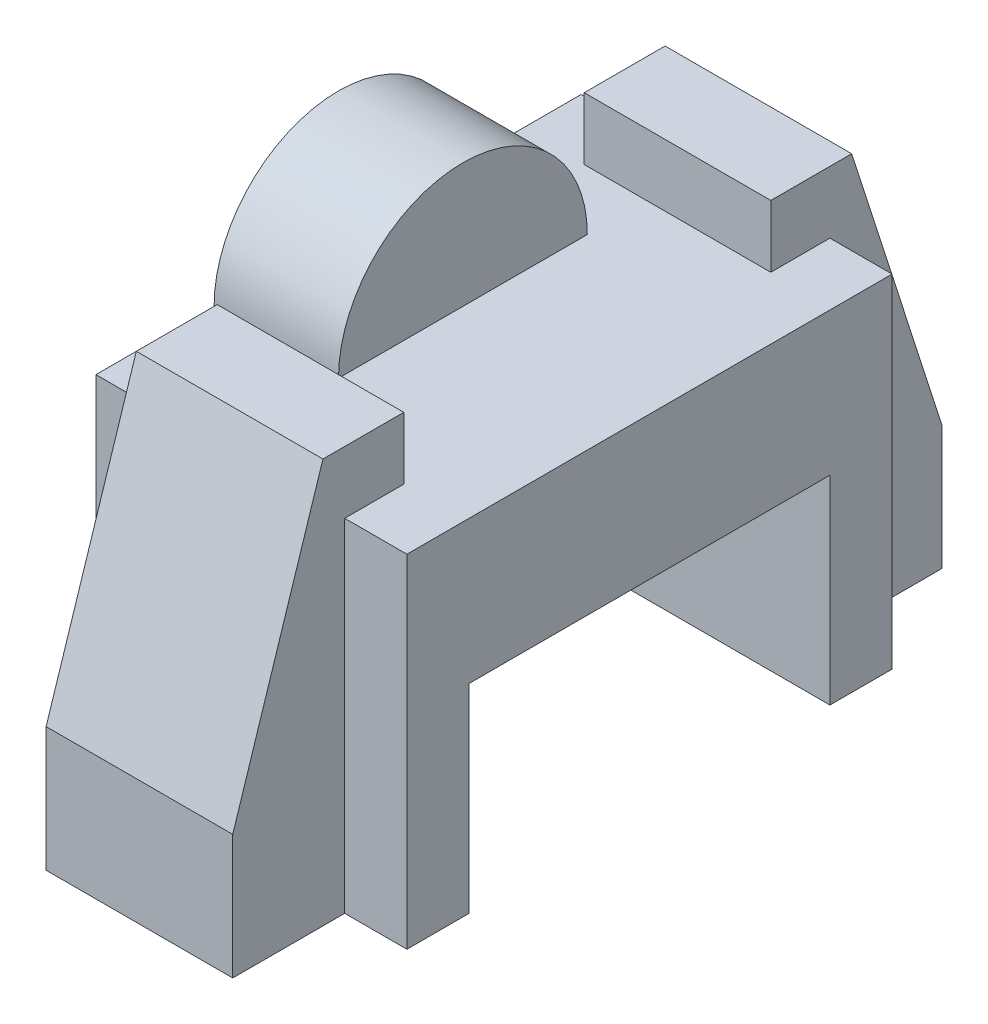
ISO-10303-21;
HEADER;
FILE_DESCRIPTION(('STEP AP214'),'2;1');
FILE_NAME('part.step','',(''),(''),'','','');
FILE_SCHEMA(('AUTOMOTIVE_DESIGN { 1 0 10303 214 1 1 1 1 }'));
ENDSEC;
DATA;
#1=APPLICATION_CONTEXT('core data for automotive mechanical design processes');
#2=APPLICATION_PROTOCOL_DEFINITION('international standard','automotive_design',2000,#1);
#3=PRODUCT_CONTEXT('',#1,'mechanical');
#4=PRODUCT('Part','Part','',(#3));
#5=PRODUCT_RELATED_PRODUCT_CATEGORY('part','',(#4));
#6=PRODUCT_DEFINITION_FORMATION('','',#4);
#7=PRODUCT_DEFINITION_CONTEXT('part definition',#1,'design');
#8=PRODUCT_DEFINITION('design','',#6,#7);
#9=PRODUCT_DEFINITION_SHAPE('','',#8);
#10=(LENGTH_UNIT() NAMED_UNIT(*) SI_UNIT(.MILLI.,.METRE.));
#11=(NAMED_UNIT(*) PLANE_ANGLE_UNIT() SI_UNIT($,.RADIAN.));
#12=(NAMED_UNIT(*) SI_UNIT($,.STERADIAN.) SOLID_ANGLE_UNIT());
#13=UNCERTAINTY_MEASURE_WITH_UNIT(LENGTH_MEASURE(1.E-05),#10,'distance_accuracy_value','');
#14=(GEOMETRIC_REPRESENTATION_CONTEXT(3) GLOBAL_UNCERTAINTY_ASSIGNED_CONTEXT((#13)) GLOBAL_UNIT_ASSIGNED_CONTEXT((#10,
#11,#12)) REPRESENTATION_CONTEXT('',''));
#15=CARTESIAN_POINT('',(0.,0.,0.));
#16=DIRECTION('',(0.,0.,1.));
#17=DIRECTION('',(1.,0.,0.));
#18=AXIS2_PLACEMENT_3D('',#15,#16,#17);
#19=CARTESIAN_POINT('',(25.,27.5,39.));
#20=DIRECTION('',(0.,-1.,0.));
#21=DIRECTION('',(0.,0.,-1.));
#22=AXIS2_PLACEMENT_3D('',#19,#20,#21);
#23=PLANE('',#22);
#24=DIRECTION('',(-1.,0.,0.));
#25=VECTOR('',#24,1.);
#26=CARTESIAN_POINT('',(-5.,27.5,20.));
#27=LINE('',#26,#25);
#28=CARTESIAN_POINT('',(-5.,27.5,20.));
#29=VERTEX_POINT('',#28);
#30=CARTESIAN_POINT('',(-25.,27.5,20.));
#31=VERTEX_POINT('',#30);
#32=EDGE_CURVE('E211',#29,#31,#27,.T.);
#33=ORIENTED_EDGE('',*,*,#32,.T.);
#34=DIRECTION('',(0.,0.,1.));
#35=VECTOR('',#34,1.);
#36=CARTESIAN_POINT('',(-25.,27.5,39.));
#37=LINE('',#36,#35);
#38=CARTESIAN_POINT('',(-25.,27.5,39.));
#39=VERTEX_POINT('',#38);
#40=EDGE_CURVE('E196',#31,#39,#37,.T.);
#41=ORIENTED_EDGE('',*,*,#40,.T.);
#42=DIRECTION('',(-1.,0.,0.));
#43=VECTOR('',#42,1.);
#44=CARTESIAN_POINT('',(25.,27.5,39.));
#45=LINE('',#44,#43);
#46=CARTESIAN_POINT('',(-15.,27.5,39.));
#47=VERTEX_POINT('',#46);
#48=EDGE_CURVE('E365',#47,#39,#45,.T.);
#49=ORIENTED_EDGE('',*,*,#48,.F.);
#50=DIRECTION('',(0.,0.,-1.));
#51=VECTOR('',#50,1.);
#52=CARTESIAN_POINT('',(-15.,27.5,39.));
#53=LINE('',#52,#51);
#54=CARTESIAN_POINT('',(-15.,27.5,29.5));
#55=VERTEX_POINT('',#54);
#56=EDGE_CURVE('E290',#47,#55,#53,.T.);
#57=ORIENTED_EDGE('',*,*,#56,.T.);
#58=DIRECTION('',(-1.,0.,0.));
#59=VECTOR('',#58,1.);
#60=CARTESIAN_POINT('',(15.,27.5,29.5));
#61=LINE('',#60,#59);
#62=CARTESIAN_POINT('',(15.,27.5,29.5));
#63=VERTEX_POINT('',#62);
#64=EDGE_CURVE('E314',#63,#55,#61,.T.);
#65=ORIENTED_EDGE('',*,*,#64,.F.);
#66=DIRECTION('',(0.,0.,-1.));
#67=VECTOR('',#66,1.);
#68=CARTESIAN_POINT('',(15.,27.5,39.));
#69=LINE('',#68,#67);
#70=CARTESIAN_POINT('',(15.,27.5,39.));
#71=VERTEX_POINT('',#70);
#72=EDGE_CURVE('E274',#71,#63,#69,.T.);
#73=ORIENTED_EDGE('',*,*,#72,.F.);
#74=CARTESIAN_POINT('',(25.,27.5,39.));
#75=VERTEX_POINT('',#74);
#76=EDGE_CURVE('E366',#75,#71,#45,.T.);
#77=ORIENTED_EDGE('',*,*,#76,.F.);
#78=DIRECTION('',(0.,0.,1.));
#79=VECTOR('',#78,1.);
#80=CARTESIAN_POINT('',(25.,27.5,39.));
#81=LINE('',#80,#79);
#82=CARTESIAN_POINT('',(25.,27.5,-39.));
#83=VERTEX_POINT('',#82);
#84=EDGE_CURVE('E319',#83,#75,#81,.T.);
#85=ORIENTED_EDGE('',*,*,#84,.F.);
#86=DIRECTION('',(-1.,0.,0.));
#87=VECTOR('',#86,1.);
#88=CARTESIAN_POINT('',(25.,27.5,-39.));
#89=LINE('',#88,#87);
#90=CARTESIAN_POINT('',(15.,27.5,-39.));
#91=VERTEX_POINT('',#90);
#92=EDGE_CURVE('E11',#83,#91,#89,.T.);
#93=ORIENTED_EDGE('',*,*,#92,.T.);
#94=DIRECTION('',(0.,0.,-1.));
#95=VECTOR('',#94,1.);
#96=CARTESIAN_POINT('',(15.,27.5,-39.));
#97=LINE('',#96,#95);
#98=CARTESIAN_POINT('',(15.,27.5,-29.5));
#99=VERTEX_POINT('',#98);
#100=EDGE_CURVE('E230',#99,#91,#97,.T.);
#101=ORIENTED_EDGE('',*,*,#100,.F.);
#102=DIRECTION('',(-1.,0.,0.));
#103=VECTOR('',#102,1.);
#104=CARTESIAN_POINT('',(15.,27.5,-29.5));
#105=LINE('',#104,#103);
#106=CARTESIAN_POINT('',(-15.,27.5,-29.5));
#107=VERTEX_POINT('',#106);
#108=EDGE_CURVE('E266',#99,#107,#105,.T.);
#109=ORIENTED_EDGE('',*,*,#108,.T.);
#110=DIRECTION('',(0.,0.,-1.));
#111=VECTOR('',#110,1.);
#112=CARTESIAN_POINT('',(-15.,27.5,-39.));
#113=LINE('',#112,#111);
#114=CARTESIAN_POINT('',(-15.,27.5,-39.));
#115=VERTEX_POINT('',#114);
#116=EDGE_CURVE('E248',#107,#115,#113,.T.);
#117=ORIENTED_EDGE('',*,*,#116,.T.);
#118=CARTESIAN_POINT('',(-25.,27.5,-39.));
#119=VERTEX_POINT('',#118);
#120=EDGE_CURVE('E44',#115,#119,#89,.T.);
#121=ORIENTED_EDGE('',*,*,#120,.T.);
#122=CARTESIAN_POINT('',(-25.,27.5,-20.));
#123=VERTEX_POINT('',#122);
#124=EDGE_CURVE('E207',#119,#123,#37,.T.);
#125=ORIENTED_EDGE('',*,*,#124,.T.);
#126=DIRECTION('',(-1.,0.,0.));
#127=VECTOR('',#126,1.);
#128=CARTESIAN_POINT('',(-5.,27.5,-20.));
#129=LINE('',#128,#127);
#130=CARTESIAN_POINT('',(-5.,27.5,-20.));
#131=VERTEX_POINT('',#130);
#132=EDGE_CURVE('E56',#131,#123,#129,.T.);
#133=ORIENTED_EDGE('',*,*,#132,.F.);
#134=DIRECTION('',(0.,0.,-1.));
#135=VECTOR('',#134,1.);
#136=CARTESIAN_POINT('',(-5.,27.5,0.));
#137=LINE('',#136,#135);
#138=EDGE_CURVE('E51',#29,#131,#137,.T.);
#139=ORIENTED_EDGE('',*,*,#138,.F.);
#140=EDGE_LOOP('',(#33,#41,#49,#57,#65,#73,#77,#85,#93,#101,#109,#117,#121,#125,#133,#139));
#141=FACE_BOUND('',#140,.T.);
#142=ADVANCED_FACE('F36',(#141),#23,.F.);
#143=CARTESIAN_POINT('',(25.,27.5,-39.));
#144=DIRECTION('',(0.,0.,1.));
#145=DIRECTION('',(1.,0.,0.));
#146=AXIS2_PLACEMENT_3D('',#143,#144,#145);
#147=PLANE('',#146);
#148=DIRECTION('',(0.,-1.,0.));
#149=VECTOR('',#148,1.);
#150=CARTESIAN_POINT('',(15.,-27.5,-39.));
#151=LINE('',#150,#149);
#152=CARTESIAN_POINT('',(15.,-27.5,-39.));
#153=VERTEX_POINT('',#152);
#154=EDGE_CURVE('E233',#91,#153,#151,.T.);
#155=ORIENTED_EDGE('',*,*,#154,.F.);
#156=ORIENTED_EDGE('',*,*,#92,.F.);
#157=DIRECTION('',(0.,1.,0.));
#158=VECTOR('',#157,1.);
#159=CARTESIAN_POINT('',(25.,27.5,-39.));
#160=LINE('',#159,#158);
#161=CARTESIAN_POINT('',(25.,-27.5,-39.));
#162=VERTEX_POINT('',#161);
#163=EDGE_CURVE('E316',#162,#83,#160,.T.);
#164=ORIENTED_EDGE('',*,*,#163,.F.);
#165=DIRECTION('',(-1.,0.,0.));
#166=VECTOR('',#165,1.);
#167=CARTESIAN_POINT('',(25.,-27.5,-39.));
#168=LINE('',#167,#166);
#169=EDGE_CURVE('E348',#162,#153,#168,.T.);
#170=ORIENTED_EDGE('',*,*,#169,.T.);
#171=EDGE_LOOP('',(#155,#156,#164,#170));
#172=FACE_BOUND('',#171,.T.);
#173=ADVANCED_FACE('F406',(#172),#147,.F.);
#174=CARTESIAN_POINT('',(25.,27.5,39.));
#175=DIRECTION('',(0.,0.,-1.));
#176=DIRECTION('',(0.,1.,0.));
#177=AXIS2_PLACEMENT_3D('',#174,#175,#176);
#178=PLANE('',#177);
#179=DIRECTION('',(0.,1.,0.));
#180=VECTOR('',#179,1.);
#181=CARTESIAN_POINT('',(15.,-27.5,39.));
#182=LINE('',#181,#180);
#183=CARTESIAN_POINT('',(15.,-27.5,39.));
#184=VERTEX_POINT('',#183);
#185=EDGE_CURVE('E272',#184,#71,#182,.T.);
#186=ORIENTED_EDGE('',*,*,#185,.F.);
#187=DIRECTION('',(-1.,0.,0.));
#188=VECTOR('',#187,1.);
#189=CARTESIAN_POINT('',(25.,-27.5,39.));
#190=LINE('',#189,#188);
#191=CARTESIAN_POINT('',(25.,-27.5,39.));
#192=VERTEX_POINT('',#191);
#193=EDGE_CURVE('E363',#192,#184,#190,.T.);
#194=ORIENTED_EDGE('',*,*,#193,.F.);
#195=DIRECTION('',(0.,-1.,0.));
#196=VECTOR('',#195,1.);
#197=CARTESIAN_POINT('',(25.,27.5,39.));
#198=LINE('',#197,#196);
#199=EDGE_CURVE('E322',#75,#192,#198,.T.);
#200=ORIENTED_EDGE('',*,*,#199,.F.);
#201=ORIENTED_EDGE('',*,*,#76,.T.);
#202=EDGE_LOOP('',(#186,#194,#200,#201));
#203=FACE_BOUND('',#202,.T.);
#204=ADVANCED_FACE('F396',(#203),#178,.F.);
#205=ORIENTED_EDGE('',*,*,#120,.F.);
#206=DIRECTION('',(0.,-1.,0.));
#207=VECTOR('',#206,1.);
#208=CARTESIAN_POINT('',(-15.,-27.5,-39.));
#209=LINE('',#208,#207);
#210=CARTESIAN_POINT('',(-15.,-27.5,-39.));
#211=VERTEX_POINT('',#210);
#212=EDGE_CURVE('E250',#115,#211,#209,.T.);
#213=ORIENTED_EDGE('',*,*,#212,.T.);
#214=CARTESIAN_POINT('',(-25.,-27.5,-39.));
#215=VERTEX_POINT('',#214);
#216=EDGE_CURVE('E334',#211,#215,#168,.T.);
#217=ORIENTED_EDGE('',*,*,#216,.T.);
#218=DIRECTION('',(0.,1.,0.));
#219=VECTOR('',#218,1.);
#220=CARTESIAN_POINT('',(-25.,27.5,-39.));
#221=LINE('',#220,#219);
#222=EDGE_CURVE('E208',#215,#119,#221,.T.);
#223=ORIENTED_EDGE('',*,*,#222,.T.);
#224=EDGE_LOOP('',(#205,#213,#217,#223));
#225=FACE_BOUND('',#224,.T.);
#226=ADVANCED_FACE('F38',(#225),#147,.F.);
#227=CARTESIAN_POINT('',(-15.,-27.5,39.));
#228=VERTEX_POINT('',#227);
#229=CARTESIAN_POINT('',(-25.,-27.5,39.));
#230=VERTEX_POINT('',#229);
#231=EDGE_CURVE('E362',#228,#230,#190,.T.);
#232=ORIENTED_EDGE('',*,*,#231,.F.);
#233=DIRECTION('',(0.,1.,0.));
#234=VECTOR('',#233,1.);
#235=CARTESIAN_POINT('',(-15.,-27.5,39.));
#236=LINE('',#235,#234);
#237=EDGE_CURVE('E271',#228,#47,#236,.T.);
#238=ORIENTED_EDGE('',*,*,#237,.T.);
#239=ORIENTED_EDGE('',*,*,#48,.T.);
#240=DIRECTION('',(0.,-1.,0.));
#241=VECTOR('',#240,1.);
#242=CARTESIAN_POINT('',(-25.,27.5,39.));
#243=LINE('',#242,#241);
#244=EDGE_CURVE('E204',#39,#230,#243,.T.);
#245=ORIENTED_EDGE('',*,*,#244,.T.);
#246=EDGE_LOOP('',(#232,#238,#239,#245));
#247=FACE_BOUND('',#246,.T.);
#248=ADVANCED_FACE('F374',(#247),#178,.F.);
#249=CARTESIAN_POINT('',(25.,-27.5,39.));
#250=DIRECTION('',(0.,1.,0.));
#251=DIRECTION('',(0.,0.,1.));
#252=AXIS2_PLACEMENT_3D('',#249,#250,#251);
#253=PLANE('',#252);
#254=DIRECTION('',(0.,0.,-1.));
#255=VECTOR('',#254,1.);
#256=CARTESIAN_POINT('',(-25.,-27.5,39.));
#257=LINE('',#256,#255);
#258=CARTESIAN_POINT('',(-25.,-27.5,29.));
#259=VERTEX_POINT('',#258);
#260=EDGE_CURVE('E338',#230,#259,#257,.T.);
#261=ORIENTED_EDGE('',*,*,#260,.T.);
#262=DIRECTION('',(-1.,0.,0.));
#263=VECTOR('',#262,1.);
#264=CARTESIAN_POINT('',(25.,-27.5,29.));
#265=LINE('',#264,#263);
#266=CARTESIAN_POINT('',(25.,-27.5,29.));
#267=VERTEX_POINT('',#266);
#268=EDGE_CURVE('E359',#267,#259,#265,.T.);
#269=ORIENTED_EDGE('',*,*,#268,.F.);
#270=DIRECTION('',(0.,0.,-1.));
#271=VECTOR('',#270,1.);
#272=CARTESIAN_POINT('',(25.,-27.5,39.));
#273=LINE('',#272,#271);
#274=EDGE_CURVE('E324',#192,#267,#273,.T.);
#275=ORIENTED_EDGE('',*,*,#274,.F.);
#276=ORIENTED_EDGE('',*,*,#193,.T.);
#277=DIRECTION('',(0.,0.,-1.));
#278=VECTOR('',#277,1.);
#279=CARTESIAN_POINT('',(15.,-27.5,57.));
#280=LINE('',#279,#278);
#281=CARTESIAN_POINT('',(15.,-27.5,57.));
#282=VERTEX_POINT('',#281);
#283=EDGE_CURVE('E285',#282,#184,#280,.T.);
#284=ORIENTED_EDGE('',*,*,#283,.F.);
#285=DIRECTION('',(-1.,0.,0.));
#286=VECTOR('',#285,1.);
#287=CARTESIAN_POINT('',(15.,-27.5,57.));
#288=LINE('',#287,#286);
#289=CARTESIAN_POINT('',(-15.,-27.5,57.));
#290=VERTEX_POINT('',#289);
#291=EDGE_CURVE('E287',#282,#290,#288,.T.);
#292=ORIENTED_EDGE('',*,*,#291,.T.);
#293=DIRECTION('',(0.,0.,-1.));
#294=VECTOR('',#293,1.);
#295=CARTESIAN_POINT('',(-15.,-27.5,57.));
#296=LINE('',#295,#294);
#297=EDGE_CURVE('E275',#290,#228,#296,.T.);
#298=ORIENTED_EDGE('',*,*,#297,.T.);
#299=ORIENTED_EDGE('',*,*,#231,.T.);
#300=EDGE_LOOP('',(#261,#269,#275,#276,#284,#292,#298,#299));
#301=FACE_BOUND('',#300,.T.);
#302=ADVANCED_FACE('F451',(#301),#253,.F.);
#303=CARTESIAN_POINT('',(25.,-27.5,29.));
#304=DIRECTION('',(0.,0.,1.));
#305=DIRECTION('',(1.,0.,0.));
#306=AXIS2_PLACEMENT_3D('',#303,#304,#305);
#307=PLANE('',#306);
#308=DIRECTION('',(0.,1.,0.));
#309=VECTOR('',#308,1.);
#310=CARTESIAN_POINT('',(-25.,-27.5,29.));
#311=LINE('',#310,#309);
#312=CARTESIAN_POINT('',(-25.,4.49999999999999,29.));
#313=VERTEX_POINT('',#312);
#314=EDGE_CURVE('E340',#259,#313,#311,.T.);
#315=ORIENTED_EDGE('',*,*,#314,.T.);
#316=DIRECTION('',(-1.,0.,0.));
#317=VECTOR('',#316,1.);
#318=CARTESIAN_POINT('',(25.,4.49999999999999,29.));
#319=LINE('',#318,#317);
#320=CARTESIAN_POINT('',(25.,4.49999999999999,29.));
#321=VERTEX_POINT('',#320);
#322=EDGE_CURVE('E356',#321,#313,#319,.T.);
#323=ORIENTED_EDGE('',*,*,#322,.F.);
#324=DIRECTION('',(0.,1.,0.));
#325=VECTOR('',#324,1.);
#326=CARTESIAN_POINT('',(25.,-27.5,29.));
#327=LINE('',#326,#325);
#328=EDGE_CURVE('E326',#267,#321,#327,.T.);
#329=ORIENTED_EDGE('',*,*,#328,.F.);
#330=ORIENTED_EDGE('',*,*,#268,.T.);
#331=EDGE_LOOP('',(#315,#323,#329,#330));
#332=FACE_BOUND('',#331,.T.);
#333=ADVANCED_FACE('F449',(#332),#307,.F.);
#334=CARTESIAN_POINT('',(25.,4.49999999999999,29.));
#335=DIRECTION('',(0.,1.,0.));
#336=DIRECTION('',(0.,0.,1.));
#337=AXIS2_PLACEMENT_3D('',#334,#335,#336);
#338=PLANE('',#337);
#339=DIRECTION('',(0.,0.,-1.));
#340=VECTOR('',#339,1.);
#341=CARTESIAN_POINT('',(-25.,4.49999999999999,29.));
#342=LINE('',#341,#340);
#343=CARTESIAN_POINT('',(-25.,4.49999999999999,-29.));
#344=VERTEX_POINT('',#343);
#345=EDGE_CURVE('E342',#313,#344,#342,.T.);
#346=ORIENTED_EDGE('',*,*,#345,.T.);
#347=DIRECTION('',(-1.,0.,0.));
#348=VECTOR('',#347,1.);
#349=CARTESIAN_POINT('',(25.,4.49999999999999,-29.));
#350=LINE('',#349,#348);
#351=CARTESIAN_POINT('',(25.,4.49999999999999,-29.));
#352=VERTEX_POINT('',#351);
#353=EDGE_CURVE('E353',#352,#344,#350,.T.);
#354=ORIENTED_EDGE('',*,*,#353,.F.);
#355=DIRECTION('',(0.,0.,-1.));
#356=VECTOR('',#355,1.);
#357=CARTESIAN_POINT('',(25.,4.49999999999999,29.));
#358=LINE('',#357,#356);
#359=EDGE_CURVE('E328',#321,#352,#358,.T.);
#360=ORIENTED_EDGE('',*,*,#359,.F.);
#361=ORIENTED_EDGE('',*,*,#322,.T.);
#362=EDGE_LOOP('',(#346,#354,#360,#361));
#363=FACE_BOUND('',#362,.T.);
#364=ADVANCED_FACE('F445',(#363),#338,.F.);
#365=CARTESIAN_POINT('',(25.,-27.5,-29.));
#366=DIRECTION('',(0.,0.,-1.));
#367=DIRECTION('',(-1.,0.,0.));
#368=AXIS2_PLACEMENT_3D('',#365,#366,#367);
#369=PLANE('',#368);
#370=DIRECTION('',(0.,-1.,0.));
#371=VECTOR('',#370,1.);
#372=CARTESIAN_POINT('',(-25.,-27.5,-29.));
#373=LINE('',#372,#371);
#374=CARTESIAN_POINT('',(-25.,-27.5,-29.));
#375=VERTEX_POINT('',#374);
#376=EDGE_CURVE('E344',#344,#375,#373,.T.);
#377=ORIENTED_EDGE('',*,*,#376,.T.);
#378=DIRECTION('',(-1.,0.,0.));
#379=VECTOR('',#378,1.);
#380=CARTESIAN_POINT('',(25.,-27.5,-29.));
#381=LINE('',#380,#379);
#382=CARTESIAN_POINT('',(25.,-27.5,-29.));
#383=VERTEX_POINT('',#382);
#384=EDGE_CURVE('E350',#383,#375,#381,.T.);
#385=ORIENTED_EDGE('',*,*,#384,.F.);
#386=DIRECTION('',(0.,-1.,0.));
#387=VECTOR('',#386,1.);
#388=CARTESIAN_POINT('',(25.,-27.5,-29.));
#389=LINE('',#388,#387);
#390=EDGE_CURVE('E330',#352,#383,#389,.T.);
#391=ORIENTED_EDGE('',*,*,#390,.F.);
#392=ORIENTED_EDGE('',*,*,#353,.T.);
#393=EDGE_LOOP('',(#377,#385,#391,#392));
#394=FACE_BOUND('',#393,.T.);
#395=ADVANCED_FACE('F441',(#394),#369,.F.);
#396=CARTESIAN_POINT('',(25.,-27.5,-29.));
#397=DIRECTION('',(0.,1.,0.));
#398=DIRECTION('',(0.,0.,1.));
#399=AXIS2_PLACEMENT_3D('',#396,#397,#398);
#400=PLANE('',#399);
#401=DIRECTION('',(0.,0.,-1.));
#402=VECTOR('',#401,1.);
#403=CARTESIAN_POINT('',(-25.,-27.5,-29.));
#404=LINE('',#403,#402);
#405=EDGE_CURVE('E320',#375,#215,#404,.T.);
#406=ORIENTED_EDGE('',*,*,#405,.T.);
#407=ORIENTED_EDGE('',*,*,#216,.F.);
#408=DIRECTION('',(0.,0.,-1.));
#409=VECTOR('',#408,1.);
#410=CARTESIAN_POINT('',(-15.,-27.5,-57.));
#411=LINE('',#410,#409);
#412=CARTESIAN_POINT('',(-15.,-27.5,-57.));
#413=VERTEX_POINT('',#412);
#414=EDGE_CURVE('E253',#211,#413,#411,.T.);
#415=ORIENTED_EDGE('',*,*,#414,.T.);
#416=DIRECTION('',(-1.,0.,0.));
#417=VECTOR('',#416,1.);
#418=CARTESIAN_POINT('',(15.,-27.5,-57.));
#419=LINE('',#418,#417);
#420=CARTESIAN_POINT('',(15.,-27.5,-57.));
#421=VERTEX_POINT('',#420);
#422=EDGE_CURVE('E263',#421,#413,#419,.T.);
#423=ORIENTED_EDGE('',*,*,#422,.F.);
#424=DIRECTION('',(0.,0.,-1.));
#425=VECTOR('',#424,1.);
#426=CARTESIAN_POINT('',(15.,-27.5,-57.));
#427=LINE('',#426,#425);
#428=EDGE_CURVE('E236',#153,#421,#427,.T.);
#429=ORIENTED_EDGE('',*,*,#428,.F.);
#430=ORIENTED_EDGE('',*,*,#169,.F.);
#431=DIRECTION('',(0.,0.,-1.));
#432=VECTOR('',#431,1.);
#433=CARTESIAN_POINT('',(25.,-27.5,-29.));
#434=LINE('',#433,#432);
#435=EDGE_CURVE('E332',#383,#162,#434,.T.);
#436=ORIENTED_EDGE('',*,*,#435,.F.);
#437=ORIENTED_EDGE('',*,*,#384,.T.);
#438=EDGE_LOOP('',(#406,#407,#415,#423,#429,#430,#436,#437));
#439=FACE_BOUND('',#438,.T.);
#440=ADVANCED_FACE('F427',(#439),#400,.F.);
#441=CARTESIAN_POINT('',(25.,0.,0.));
#442=DIRECTION('',(1.,0.,0.));
#443=DIRECTION('',(0.,0.,-1.));
#444=AXIS2_PLACEMENT_3D('',#441,#442,#443);
#445=PLANE('',#444);
#446=ORIENTED_EDGE('',*,*,#163,.T.);
#447=ORIENTED_EDGE('',*,*,#84,.T.);
#448=ORIENTED_EDGE('',*,*,#199,.T.);
#449=ORIENTED_EDGE('',*,*,#274,.T.);
#450=ORIENTED_EDGE('',*,*,#328,.T.);
#451=ORIENTED_EDGE('',*,*,#359,.T.);
#452=ORIENTED_EDGE('',*,*,#390,.T.);
#453=ORIENTED_EDGE('',*,*,#435,.T.);
#454=EDGE_LOOP('',(#446,#447,#448,#449,#450,#451,#452,#453));
#455=FACE_BOUND('',#454,.T.);
#456=ADVANCED_FACE('F399',(#455),#445,.T.);
#457=CARTESIAN_POINT('',(-25.,0.,0.));
#458=DIRECTION('',(1.,0.,0.));
#459=DIRECTION('',(0.,0.,-1.));
#460=AXIS2_PLACEMENT_3D('',#457,#458,#459);
#461=PLANE('',#460);
#462=ORIENTED_EDGE('',*,*,#222,.F.);
#463=ORIENTED_EDGE('',*,*,#405,.F.);
#464=ORIENTED_EDGE('',*,*,#376,.F.);
#465=ORIENTED_EDGE('',*,*,#345,.F.);
#466=ORIENTED_EDGE('',*,*,#314,.F.);
#467=ORIENTED_EDGE('',*,*,#260,.F.);
#468=ORIENTED_EDGE('',*,*,#244,.F.);
#469=ORIENTED_EDGE('',*,*,#40,.F.);
#470=CARTESIAN_POINT('',(-25.,27.5,0.));
#471=DIRECTION('',(1.,0.,0.));
#472=DIRECTION('',(0.,0.,-1.));
#473=AXIS2_PLACEMENT_3D('',#470,#471,#472);
#474=CIRCLE('',#473,20.);
#475=EDGE_CURVE('E201',#123,#31,#474,.T.);
#476=ORIENTED_EDGE('',*,*,#475,.F.);
#477=ORIENTED_EDGE('',*,*,#124,.F.);
#478=EDGE_LOOP('',(#462,#463,#464,#465,#466,#467,#468,#469,#476,#477));
#479=FACE_BOUND('',#478,.T.);
#480=ADVANCED_FACE('F198',(#479),#461,.F.);
#481=CARTESIAN_POINT('',(15.,27.5,29.5));
#482=DIRECTION('',(0.,0.,1.));
#483=DIRECTION('',(1.,0.,0.));
#484=AXIS2_PLACEMENT_3D('',#481,#482,#483);
#485=PLANE('',#484);
#486=DIRECTION('',(0.,1.,0.));
#487=VECTOR('',#486,1.);
#488=CARTESIAN_POINT('',(-15.,27.5,29.5));
#489=LINE('',#488,#487);
#490=CARTESIAN_POINT('',(-15.,37.5,29.5));
#491=VERTEX_POINT('',#490);
#492=EDGE_CURVE('E293',#55,#491,#489,.T.);
#493=ORIENTED_EDGE('',*,*,#492,.T.);
#494=DIRECTION('',(-1.,0.,0.));
#495=VECTOR('',#494,1.);
#496=CARTESIAN_POINT('',(15.,37.5,29.5));
#497=LINE('',#496,#495);
#498=CARTESIAN_POINT('',(15.,37.5,29.5));
#499=VERTEX_POINT('',#498);
#500=EDGE_CURVE('E311',#499,#491,#497,.T.);
#501=ORIENTED_EDGE('',*,*,#500,.F.);
#502=DIRECTION('',(0.,1.,0.));
#503=VECTOR('',#502,1.);
#504=CARTESIAN_POINT('',(15.,27.5,29.5));
#505=LINE('',#504,#503);
#506=EDGE_CURVE('E277',#63,#499,#505,.T.);
#507=ORIENTED_EDGE('',*,*,#506,.F.);
#508=ORIENTED_EDGE('',*,*,#64,.T.);
#509=EDGE_LOOP('',(#493,#501,#507,#508));
#510=FACE_BOUND('',#509,.T.);
#511=ADVANCED_FACE('F385',(#510),#485,.F.);
#512=CARTESIAN_POINT('',(15.,37.5,29.5));
#513=DIRECTION('',(0.,-1.,0.));
#514=DIRECTION('',(0.,0.,-1.));
#515=AXIS2_PLACEMENT_3D('',#512,#513,#514);
#516=PLANE('',#515);
#517=DIRECTION('',(0.,0.,1.));
#518=VECTOR('',#517,1.);
#519=CARTESIAN_POINT('',(-15.,37.5,29.5));
#520=LINE('',#519,#518);
#521=CARTESIAN_POINT('',(-15.,37.5,42.5));
#522=VERTEX_POINT('',#521);
#523=EDGE_CURVE('E295',#491,#522,#520,.T.);
#524=ORIENTED_EDGE('',*,*,#523,.T.);
#525=DIRECTION('',(-1.,0.,0.));
#526=VECTOR('',#525,1.);
#527=CARTESIAN_POINT('',(15.,37.5,42.5));
#528=LINE('',#527,#526);
#529=CARTESIAN_POINT('',(15.,37.5,42.5));
#530=VERTEX_POINT('',#529);
#531=EDGE_CURVE('E308',#530,#522,#528,.T.);
#532=ORIENTED_EDGE('',*,*,#531,.F.);
#533=DIRECTION('',(0.,0.,1.));
#534=VECTOR('',#533,1.);
#535=CARTESIAN_POINT('',(15.,37.5,29.5));
#536=LINE('',#535,#534);
#537=EDGE_CURVE('E279',#499,#530,#536,.T.);
#538=ORIENTED_EDGE('',*,*,#537,.F.);
#539=ORIENTED_EDGE('',*,*,#500,.T.);
#540=EDGE_LOOP('',(#524,#532,#538,#539));
#541=FACE_BOUND('',#540,.T.);
#542=ADVANCED_FACE('F389',(#541),#516,.F.);
#543=CARTESIAN_POINT('',(15.,37.5,42.5));
#544=DIRECTION('',(0.,-0.306693767453373,-0.951808243820811));
#545=DIRECTION('',(0.,0.951808243820811,-0.306693767453373));
#546=AXIS2_PLACEMENT_3D('',#543,#544,#545);
#547=PLANE('',#546);
#548=DIRECTION('',(0.,-0.951808243820811,0.306693767453373));
#549=VECTOR('',#548,1.);
#550=CARTESIAN_POINT('',(-15.,37.5,42.5));
#551=LINE('',#550,#549);
#552=CARTESIAN_POINT('',(-15.,-7.50000000000001,57.));
#553=VERTEX_POINT('',#552);
#554=EDGE_CURVE('E297',#522,#553,#551,.T.);
#555=ORIENTED_EDGE('',*,*,#554,.T.);
#556=DIRECTION('',(-1.,0.,0.));
#557=VECTOR('',#556,1.);
#558=CARTESIAN_POINT('',(15.,-7.50000000000001,57.));
#559=LINE('',#558,#557);
#560=CARTESIAN_POINT('',(15.,-7.50000000000001,57.));
#561=VERTEX_POINT('',#560);
#562=EDGE_CURVE('E305',#561,#553,#559,.T.);
#563=ORIENTED_EDGE('',*,*,#562,.F.);
#564=DIRECTION('',(0.,-0.951808243820811,0.306693767453373));
#565=VECTOR('',#564,1.);
#566=CARTESIAN_POINT('',(15.,37.5,42.5));
#567=LINE('',#566,#565);
#568=EDGE_CURVE('E281',#530,#561,#567,.T.);
#569=ORIENTED_EDGE('',*,*,#568,.F.);
#570=ORIENTED_EDGE('',*,*,#531,.T.);
#571=EDGE_LOOP('',(#555,#563,#569,#570));
#572=FACE_BOUND('',#571,.T.);
#573=ADVANCED_FACE('F459',(#572),#547,.F.);
#574=CARTESIAN_POINT('',(15.,-7.50000000000001,57.));
#575=DIRECTION('',(0.,0.,-1.));
#576=DIRECTION('',(-1.,0.,0.));
#577=AXIS2_PLACEMENT_3D('',#574,#575,#576);
#578=PLANE('',#577);
#579=DIRECTION('',(0.,-1.,0.));
#580=VECTOR('',#579,1.);
#581=CARTESIAN_POINT('',(-15.,-7.50000000000001,57.));
#582=LINE('',#581,#580);
#583=EDGE_CURVE('E299',#553,#290,#582,.T.);
#584=ORIENTED_EDGE('',*,*,#583,.T.);
#585=ORIENTED_EDGE('',*,*,#291,.F.);
#586=DIRECTION('',(0.,-1.,0.));
#587=VECTOR('',#586,1.);
#588=CARTESIAN_POINT('',(15.,-7.50000000000001,57.));
#589=LINE('',#588,#587);
#590=EDGE_CURVE('E283',#561,#282,#589,.T.);
#591=ORIENTED_EDGE('',*,*,#590,.F.);
#592=ORIENTED_EDGE('',*,*,#562,.T.);
#593=EDGE_LOOP('',(#584,#585,#591,#592));
#594=FACE_BOUND('',#593,.T.);
#595=ADVANCED_FACE('F456',(#594),#578,.F.);
#596=CARTESIAN_POINT('',(15.,0.,0.));
#597=DIRECTION('',(-1.,0.,0.));
#598=DIRECTION('',(0.,0.,1.));
#599=AXIS2_PLACEMENT_3D('',#596,#597,#598);
#600=PLANE('',#599);
#601=ORIENTED_EDGE('',*,*,#185,.T.);
#602=ORIENTED_EDGE('',*,*,#72,.T.);
#603=ORIENTED_EDGE('',*,*,#506,.T.);
#604=ORIENTED_EDGE('',*,*,#537,.T.);
#605=ORIENTED_EDGE('',*,*,#568,.T.);
#606=ORIENTED_EDGE('',*,*,#590,.T.);
#607=ORIENTED_EDGE('',*,*,#283,.T.);
#608=EDGE_LOOP('',(#601,#602,#603,#604,#605,#606,#607));
#609=FACE_BOUND('',#608,.T.);
#610=ADVANCED_FACE('F393',(#609),#600,.F.);
#611=CARTESIAN_POINT('',(-15.,0.,0.));
#612=DIRECTION('',(-1.,0.,0.));
#613=DIRECTION('',(0.,0.,1.));
#614=AXIS2_PLACEMENT_3D('',#611,#612,#613);
#615=PLANE('',#614);
#616=ORIENTED_EDGE('',*,*,#237,.F.);
#617=ORIENTED_EDGE('',*,*,#297,.F.);
#618=ORIENTED_EDGE('',*,*,#583,.F.);
#619=ORIENTED_EDGE('',*,*,#554,.F.);
#620=ORIENTED_EDGE('',*,*,#523,.F.);
#621=ORIENTED_EDGE('',*,*,#492,.F.);
#622=ORIENTED_EDGE('',*,*,#56,.F.);
#623=EDGE_LOOP('',(#616,#617,#618,#619,#620,#621,#622));
#624=FACE_BOUND('',#623,.T.);
#625=ADVANCED_FACE('F379',(#624),#615,.T.);
#626=CARTESIAN_POINT('',(15.,37.5,-29.5));
#627=DIRECTION('',(0.,-1.,0.));
#628=DIRECTION('',(0.,0.,-1.));
#629=AXIS2_PLACEMENT_3D('',#626,#627,#628);
#630=PLANE('',#629);
#631=DIRECTION('',(0.,0.,1.));
#632=VECTOR('',#631,1.);
#633=CARTESIAN_POINT('',(-15.,37.5,-29.5));
#634=LINE('',#633,#632);
#635=CARTESIAN_POINT('',(-15.,37.5,-42.5));
#636=VERTEX_POINT('',#635);
#637=CARTESIAN_POINT('',(-15.,37.5,-29.5));
#638=VERTEX_POINT('',#637);
#639=EDGE_CURVE('E214',#636,#638,#634,.T.);
#640=ORIENTED_EDGE('',*,*,#639,.T.);
#641=DIRECTION('',(-1.,0.,0.));
#642=VECTOR('',#641,1.);
#643=CARTESIAN_POINT('',(15.,37.5,-29.5));
#644=LINE('',#643,#642);
#645=CARTESIAN_POINT('',(15.,37.5,-29.5));
#646=VERTEX_POINT('',#645);
#647=EDGE_CURVE('E268',#646,#638,#644,.T.);
#648=ORIENTED_EDGE('',*,*,#647,.F.);
#649=DIRECTION('',(0.,0.,1.));
#650=VECTOR('',#649,1.);
#651=CARTESIAN_POINT('',(15.,37.5,-29.5));
#652=LINE('',#651,#650);
#653=CARTESIAN_POINT('',(15.,37.5,-42.5));
#654=VERTEX_POINT('',#653);
#655=EDGE_CURVE('E223',#654,#646,#652,.T.);
#656=ORIENTED_EDGE('',*,*,#655,.F.);
#657=DIRECTION('',(-1.,0.,0.));
#658=VECTOR('',#657,1.);
#659=CARTESIAN_POINT('',(15.,37.5,-42.5));
#660=LINE('',#659,#658);
#661=EDGE_CURVE('E242',#654,#636,#660,.T.);
#662=ORIENTED_EDGE('',*,*,#661,.T.);
#663=EDGE_LOOP('',(#640,#648,#656,#662));
#664=FACE_BOUND('',#663,.T.);
#665=ADVANCED_FACE('F526',(#664),#630,.F.);
#666=CARTESIAN_POINT('',(15.,27.5,-29.5));
#667=DIRECTION('',(0.,0.,-1.));
#668=DIRECTION('',(-1.,0.,0.));
#669=AXIS2_PLACEMENT_3D('',#666,#667,#668);
#670=PLANE('',#669);
#671=DIRECTION('',(0.,-1.,0.));
#672=VECTOR('',#671,1.);
#673=CARTESIAN_POINT('',(-15.,27.5,-29.5));
#674=LINE('',#673,#672);
#675=EDGE_CURVE('E245',#638,#107,#674,.T.);
#676=ORIENTED_EDGE('',*,*,#675,.T.);
#677=ORIENTED_EDGE('',*,*,#108,.F.);
#678=DIRECTION('',(0.,-1.,0.));
#679=VECTOR('',#678,1.);
#680=CARTESIAN_POINT('',(15.,27.5,-29.5));
#681=LINE('',#680,#679);
#682=EDGE_CURVE('E226',#646,#99,#681,.T.);
#683=ORIENTED_EDGE('',*,*,#682,.F.);
#684=ORIENTED_EDGE('',*,*,#647,.T.);
#685=EDGE_LOOP('',(#676,#677,#683,#684));
#686=FACE_BOUND('',#685,.T.);
#687=ADVANCED_FACE('F414',(#686),#670,.F.);
#688=CARTESIAN_POINT('',(15.,-7.50000000000001,-57.));
#689=DIRECTION('',(0.,0.,1.));
#690=DIRECTION('',(1.,0.,0.));
#691=AXIS2_PLACEMENT_3D('',#688,#689,#690);
#692=PLANE('',#691);
#693=DIRECTION('',(0.,1.,0.));
#694=VECTOR('',#693,1.);
#695=CARTESIAN_POINT('',(-15.,-7.50000000000001,-57.));
#696=LINE('',#695,#694);
#697=CARTESIAN_POINT('',(-15.,-7.50000000000001,-57.));
#698=VERTEX_POINT('',#697);
#699=EDGE_CURVE('E255',#413,#698,#696,.T.);
#700=ORIENTED_EDGE('',*,*,#699,.T.);
#701=DIRECTION('',(-1.,0.,0.));
#702=VECTOR('',#701,1.);
#703=CARTESIAN_POINT('',(15.,-7.50000000000001,-57.));
#704=LINE('',#703,#702);
#705=CARTESIAN_POINT('',(15.,-7.50000000000001,-57.));
#706=VERTEX_POINT('',#705);
#707=EDGE_CURVE('E260',#706,#698,#704,.T.);
#708=ORIENTED_EDGE('',*,*,#707,.F.);
#709=DIRECTION('',(0.,1.,0.));
#710=VECTOR('',#709,1.);
#711=CARTESIAN_POINT('',(15.,-7.50000000000001,-57.));
#712=LINE('',#711,#710);
#713=EDGE_CURVE('E238',#421,#706,#712,.T.);
#714=ORIENTED_EDGE('',*,*,#713,.F.);
#715=ORIENTED_EDGE('',*,*,#422,.T.);
#716=EDGE_LOOP('',(#700,#708,#714,#715));
#717=FACE_BOUND('',#716,.T.);
#718=ADVANCED_FACE('F430',(#717),#692,.F.);
#719=CARTESIAN_POINT('',(15.,37.5,-42.5));
#720=DIRECTION('',(0.,-0.306693767453373,0.951808243820811));
#721=DIRECTION('',(0.,-0.951808243820811,-0.306693767453373));
#722=AXIS2_PLACEMENT_3D('',#719,#720,#721);
#723=PLANE('',#722);
#724=DIRECTION('',(0.,0.951808243820811,0.306693767453373));
#725=VECTOR('',#724,1.);
#726=CARTESIAN_POINT('',(-15.,37.5,-42.5));
#727=LINE('',#726,#725);
#728=EDGE_CURVE('E227',#698,#636,#727,.T.);
#729=ORIENTED_EDGE('',*,*,#728,.T.);
#730=ORIENTED_EDGE('',*,*,#661,.F.);
#731=DIRECTION('',(0.,0.951808243820811,0.306693767453373));
#732=VECTOR('',#731,1.);
#733=CARTESIAN_POINT('',(15.,37.5,-42.5));
#734=LINE('',#733,#732);
#735=EDGE_CURVE('E240',#706,#654,#734,.T.);
#736=ORIENTED_EDGE('',*,*,#735,.F.);
#737=ORIENTED_EDGE('',*,*,#707,.T.);
#738=EDGE_LOOP('',(#729,#730,#736,#737));
#739=FACE_BOUND('',#738,.T.);
#740=ADVANCED_FACE('F552',(#739),#723,.F.);
#741=CARTESIAN_POINT('',(15.,0.,0.));
#742=DIRECTION('',(-1.,0.,0.));
#743=DIRECTION('',(0.,0.,1.));
#744=AXIS2_PLACEMENT_3D('',#741,#742,#743);
#745=PLANE('',#744);
#746=ORIENTED_EDGE('',*,*,#655,.T.);
#747=ORIENTED_EDGE('',*,*,#682,.T.);
#748=ORIENTED_EDGE('',*,*,#100,.T.);
#749=ORIENTED_EDGE('',*,*,#154,.T.);
#750=ORIENTED_EDGE('',*,*,#428,.T.);
#751=ORIENTED_EDGE('',*,*,#713,.T.);
#752=ORIENTED_EDGE('',*,*,#735,.T.);
#753=EDGE_LOOP('',(#746,#747,#748,#749,#750,#751,#752));
#754=FACE_BOUND('',#753,.T.);
#755=ADVANCED_FACE('F408',(#754),#745,.F.);
#756=CARTESIAN_POINT('',(-15.,0.,0.));
#757=DIRECTION('',(-1.,0.,0.));
#758=DIRECTION('',(0.,0.,1.));
#759=AXIS2_PLACEMENT_3D('',#756,#757,#758);
#760=PLANE('',#759);
#761=ORIENTED_EDGE('',*,*,#639,.F.);
#762=ORIENTED_EDGE('',*,*,#728,.F.);
#763=ORIENTED_EDGE('',*,*,#699,.F.);
#764=ORIENTED_EDGE('',*,*,#414,.F.);
#765=ORIENTED_EDGE('',*,*,#212,.F.);
#766=ORIENTED_EDGE('',*,*,#116,.F.);
#767=ORIENTED_EDGE('',*,*,#675,.F.);
#768=EDGE_LOOP('',(#761,#762,#763,#764,#765,#766,#767));
#769=FACE_BOUND('',#768,.T.);
#770=ADVANCED_FACE('F422',(#769),#760,.T.);
#771=CARTESIAN_POINT('',(-5.,27.5,0.));
#772=DIRECTION('',(-1.,0.,0.));
#773=DIRECTION('',(0.,0.,1.));
#774=AXIS2_PLACEMENT_3D('',#771,#772,#773);
#775=CYLINDRICAL_SURFACE('',#774,20.);
#776=ORIENTED_EDGE('',*,*,#475,.T.);
#777=ORIENTED_EDGE('',*,*,#32,.F.);
#778=CARTESIAN_POINT('',(-5.,27.5,0.));
#779=DIRECTION('',(1.,0.,0.));
#780=DIRECTION('',(0.,0.,-1.));
#781=AXIS2_PLACEMENT_3D('',#778,#779,#780);
#782=CIRCLE('',#781,20.);
#783=EDGE_CURVE('E217',#131,#29,#782,.T.);
#784=ORIENTED_EDGE('',*,*,#783,.F.);
#785=ORIENTED_EDGE('',*,*,#132,.T.);
#786=EDGE_LOOP('',(#776,#777,#784,#785));
#787=FACE_BOUND('',#786,.T.);
#788=ADVANCED_FACE('F216',(#787),#775,.T.);
#789=CARTESIAN_POINT('',(-5.,27.5,0.));
#790=DIRECTION('',(1.,0.,0.));
#791=DIRECTION('',(0.,0.,-1.));
#792=AXIS2_PLACEMENT_3D('',#789,#790,#791);
#793=PLANE('',#792);
#794=ORIENTED_EDGE('',*,*,#783,.T.);
#795=ORIENTED_EDGE('',*,*,#138,.T.);
#796=EDGE_LOOP('',(#794,#795));
#797=FACE_BOUND('',#796,.T.);
#798=ADVANCED_FACE('F595',(#797),#793,.T.);
#799=CLOSED_SHELL('',(#142,#173,#204,#226,#248,#302,#333,#364,#395,#440,#456,#480,#511,#542,
#573,#595,#610,#625,#665,#687,#718,#740,#755,#770,#788,#798));
#800=MANIFOLD_SOLID_BREP('B2',#799);
#801=ADVANCED_BREP_SHAPE_REPRESENTATION('',(#18,#800),#14);
#802=SHAPE_DEFINITION_REPRESENTATION(#9,#801);
ENDSEC;
END-ISO-10303-21;
